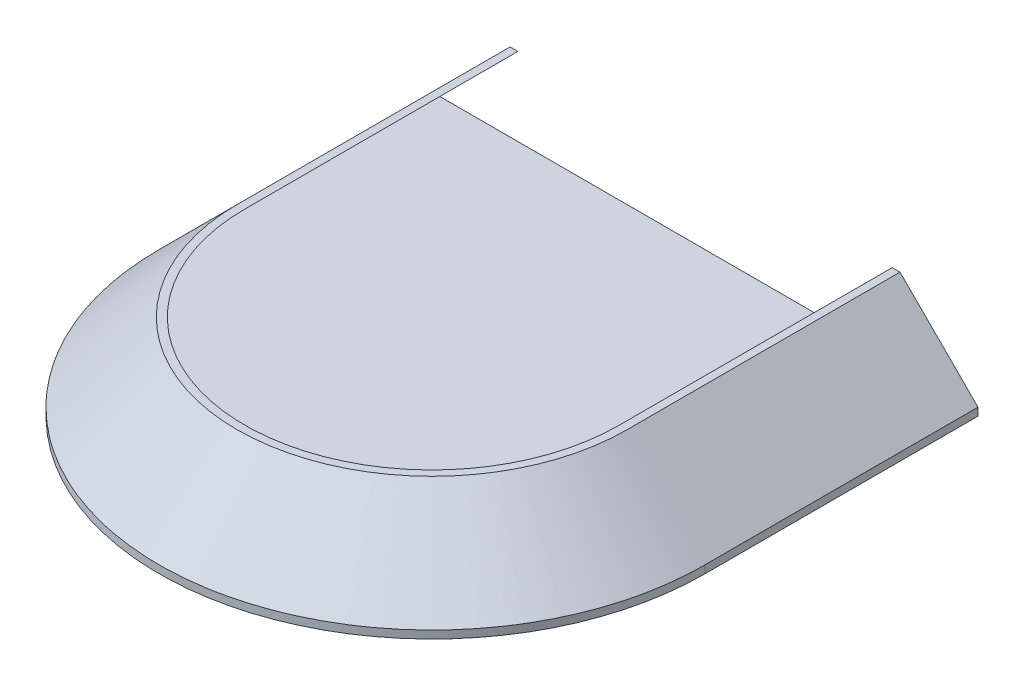
ISO-10303-21;
HEADER;
FILE_DESCRIPTION(('STEP AP214'),'2;1');
FILE_NAME('part.step','',(''),(''),'','','');
FILE_SCHEMA(('AUTOMOTIVE_DESIGN { 1 0 10303 214 1 1 1 1 }'));
ENDSEC;
DATA;
#1=APPLICATION_CONTEXT('core data for automotive mechanical design processes');
#2=APPLICATION_PROTOCOL_DEFINITION('international standard','automotive_design',2000,#1);
#3=PRODUCT_CONTEXT('',#1,'mechanical');
#4=PRODUCT('Part','Part','',(#3));
#5=PRODUCT_RELATED_PRODUCT_CATEGORY('part','',(#4));
#6=PRODUCT_DEFINITION_FORMATION('','',#4);
#7=PRODUCT_DEFINITION_CONTEXT('part definition',#1,'design');
#8=PRODUCT_DEFINITION('design','',#6,#7);
#9=PRODUCT_DEFINITION_SHAPE('','',#8);
#10=(LENGTH_UNIT() NAMED_UNIT(*) SI_UNIT(.MILLI.,.METRE.));
#11=(NAMED_UNIT(*) PLANE_ANGLE_UNIT() SI_UNIT($,.RADIAN.));
#12=(NAMED_UNIT(*) SI_UNIT($,.STERADIAN.) SOLID_ANGLE_UNIT());
#13=UNCERTAINTY_MEASURE_WITH_UNIT(LENGTH_MEASURE(1.E-05),#10,'distance_accuracy_value','');
#14=(GEOMETRIC_REPRESENTATION_CONTEXT(3) GLOBAL_UNCERTAINTY_ASSIGNED_CONTEXT((#13)) GLOBAL_UNIT_ASSIGNED_CONTEXT((#10,
#11,#12)) REPRESENTATION_CONTEXT('',''));
#15=CARTESIAN_POINT('',(0.,0.,0.));
#16=DIRECTION('',(0.,0.,1.));
#17=DIRECTION('',(1.,0.,0.));
#18=AXIS2_PLACEMENT_3D('',#15,#16,#17);
#19=CARTESIAN_POINT('',(460.336189438101,915.638937529955,1540.02120328592));
#20=DIRECTION('',(0.,1.,0.));
#21=DIRECTION('',(0.,0.,1.));
#22=AXIS2_PLACEMENT_3D('',#19,#20,#21);
#23=PLANE('',#22);
#24=DIRECTION('',(-1.,0.,0.));
#25=VECTOR('',#24,1.);
#26=CARTESIAN_POINT('',(549.236189438101,915.638937529955,1451.12120328592));
#27=LINE('',#26,#25);
#28=CARTESIAN_POINT('',(546.696189438101,915.638937529955,1451.12120328592));
#29=VERTEX_POINT('',#28);
#30=CARTESIAN_POINT('',(373.976189438101,915.638937529955,1451.12120328592));
#31=VERTEX_POINT('',#30);
#32=EDGE_CURVE('E426',#29,#31,#27,.T.);
#33=ORIENTED_EDGE('',*,*,#32,.T.);
#34=DIRECTION('',(0.,0.,-1.));
#35=VECTOR('',#34,1.);
#36=CARTESIAN_POINT('',(373.976189438101,915.638937529955,1451.12120328592));
#37=LINE('',#36,#35);
#38=CARTESIAN_POINT('',(373.976189438101,915.638937529955,1540.02120328592));
#39=VERTEX_POINT('',#38);
#40=EDGE_CURVE('E451',#39,#31,#37,.T.);
#41=ORIENTED_EDGE('',*,*,#40,.F.);
#42=CARTESIAN_POINT('',(546.696189438101,915.638937529955,1540.02120328592));
#43=CARTESIAN_POINT('',(546.69618439153,915.638937529955,1541.23535219559));
#44=CARTESIAN_POINT('',(546.670505692244,915.638937529955,1542.44949529698));
#45=CARTESIAN_POINT('',(546.568005410644,915.638937529955,1544.87557297002));
#46=CARTESIAN_POINT('',(546.491185871674,915.638937529955,1546.08750762799));
#47=CARTESIAN_POINT('',(546.286610799454,915.638937529955,1548.50703930376));
#48=CARTESIAN_POINT('',(546.158856510747,915.638937529955,1549.71463642683));
#49=CARTESIAN_POINT('',(545.852610112405,915.638937529955,1552.12336926867));
#50=CARTESIAN_POINT('',(545.67411853701,915.638937529955,1553.32450505534));
#51=CARTESIAN_POINT('',(545.266675008717,915.638937529955,1555.71733474795));
#52=CARTESIAN_POINT('',(545.037757996229,915.638937529955,1556.90903460272));
#53=CARTESIAN_POINT('',(544.529827402411,915.638937529955,1559.28169752831));
#54=CARTESIAN_POINT('',(544.250814302356,915.638937529955,1560.46266070217));
#55=CARTESIAN_POINT('',(543.643364107768,915.638937529955,1562.81179284593));
#56=CARTESIAN_POINT('',(543.314927230122,915.638937529954,1563.97996187195));
#57=CARTESIAN_POINT('',(542.609206332688,915.638937529955,1566.30146843609));
#58=CARTESIAN_POINT('',(542.23192264606,915.638937529957,1567.4548060753));
#59=CARTESIAN_POINT('',(541.562683324696,915.638937529956,1569.36360383138));
#60=CARTESIAN_POINT('',(541.284099063734,915.638937529955,1570.12377845583));
#61=CARTESIAN_POINT('',(540.705612424955,915.638937529955,1571.63597666617));
#62=CARTESIAN_POINT('',(540.405709619327,915.638937529955,1572.38800008814));
#63=CARTESIAN_POINT('',(539.474388514593,915.638937529955,1574.63092043347));
#64=CARTESIAN_POINT('',(538.811304982171,915.638937529955,1576.10881730184));
#65=CARTESIAN_POINT('',(537.403317268604,915.638937529955,1579.02496361593));
#66=CARTESIAN_POINT('',(536.658413131512,915.638937529955,1580.463213083));
#67=CARTESIAN_POINT('',(535.08914554377,915.638937529955,1583.29547307954));
#68=CARTESIAN_POINT('',(534.264797427979,915.638937529955,1584.68949207792));
#69=CARTESIAN_POINT('',(532.970446372624,915.638937529955,1586.74386662349));
#70=CARTESIAN_POINT('',(532.529334789541,915.638937529955,1587.42258157969));
#71=CARTESIAN_POINT('',(531.628167606513,915.638937529955,1588.76730031018));
#72=CARTESIAN_POINT('',(531.168112206796,915.638937529955,1589.43330421871));
#73=CARTESIAN_POINT('',(529.760140445629,915.638937529955,1591.41152750533));
#74=CARTESIAN_POINT('',(528.784335608015,915.638937529954,1592.7040899955));
#75=CARTESIAN_POINT('',(527.015003356373,915.638937529954,1594.91590148438));
#76=CARTESIAN_POINT('',(526.236968622904,915.638937529955,1595.84762737363));
#77=CARTESIAN_POINT('',(524.642285525517,915.638937529955,1597.67758562142));
#78=CARTESIAN_POINT('',(523.825634938852,915.638937529955,1598.5758160466));
#79=CARTESIAN_POINT('',(522.155105476662,915.638937529955,1600.33691326455));
#80=CARTESIAN_POINT('',(521.30122738258,915.638937529955,1601.19978079889));
#81=CARTESIAN_POINT('',(519.557832796711,915.638937529955,1602.88870871453));
#82=CARTESIAN_POINT('',(518.668316711846,915.638937529955,1603.71476951589));
#83=CARTESIAN_POINT('',(516.855185954716,915.638937529955,1605.32886320682));
#84=CARTESIAN_POINT('',(515.931566104838,915.638937529955,1606.1168902799));
#85=CARTESIAN_POINT('',(514.051989560718,915.638937529955,1607.65339019125));
#86=CARTESIAN_POINT('',(513.096032835804,915.638937529955,1608.401862992));
#87=CARTESIAN_POINT('',(511.153415686436,915.638937529955,1609.85785014707));
#88=CARTESIAN_POINT('',(510.166755231706,915.638937529955,1610.565364461));
#89=CARTESIAN_POINT('',(508.16437843336,915.638937529954,1611.93800616568));
#90=CARTESIAN_POINT('',(507.148662085295,915.638937529953,1612.60313354994));
#91=CARTESIAN_POINT('',(505.09024822099,915.638937529953,1613.8899028947));
#92=CARTESIAN_POINT('',(504.047554524414,915.638937529954,1614.51155096568));
#93=CARTESIAN_POINT('',(501.936952538603,915.638937529955,1615.7104373739));
#94=CARTESIAN_POINT('',(500.869044279825,915.638937529955,1616.28767576478));
#95=CARTESIAN_POINT('',(498.709863837533,915.638937529955,1617.39672397846));
#96=CARTESIAN_POINT('',(497.618591756358,915.638937529955,1617.92853400019));
#97=CARTESIAN_POINT('',(495.414667836763,915.638937529955,1618.9455919365));
#98=CARTESIAN_POINT('',(494.302015746628,915.638937529955,1619.43083930247));
#99=CARTESIAN_POINT('',(490.934826814243,915.638937529955,1620.81530136655));
#100=CARTESIAN_POINT('',(488.650423069511,915.638937529955,1621.64356185504));
#101=CARTESIAN_POINT('',(485.178852429648,915.638937529955,1622.73956062363));
#102=CARTESIAN_POINT('',(484.014110037235,915.638937529955,1623.08050796758));
#103=CARTESIAN_POINT('',(481.670905722688,915.638937529955,1623.7132089889));
#104=CARTESIAN_POINT('',(480.492440455143,915.638937529954,1624.00495039041));
#105=CARTESIAN_POINT('',(478.12360990974,915.638937529954,1624.53850850277));
#106=CARTESIAN_POINT('',(476.933238441319,915.638937529955,1624.7802976571));
#107=CARTESIAN_POINT('',(474.54319877114,915.638937529955,1625.2133634915));
#108=CARTESIAN_POINT('',(473.343529544223,915.638937529955,1625.40463451754));
#109=CARTESIAN_POINT('',(470.937261630072,915.638937529955,1625.73648404064));
#110=CARTESIAN_POINT('',(469.730663270572,915.638937529955,1625.8770649155));
#111=CARTESIAN_POINT('',(467.312619208529,915.638937529955,1626.10732186026));
#112=CARTESIAN_POINT('',(466.101173507352,915.638937529955,1626.19699794451));
#113=CARTESIAN_POINT('',(463.675384697821,915.638937529955,1626.32524053165));
#114=CARTESIAN_POINT('',(462.46104116376,915.638937529955,1626.36379899441));
#115=CARTESIAN_POINT('',(460.032134596746,915.638937529955,1626.38946949797));
#116=CARTESIAN_POINT('',(458.817571705814,915.638937529955,1626.37659508426));
#117=CARTESIAN_POINT('',(456.389943212374,915.638937529955,1626.29957212948));
#118=CARTESIAN_POINT('',(455.176877757879,915.638937529955,1626.23541887184));
#119=CARTESIAN_POINT('',(452.754509860456,915.638937529955,1626.05611104466));
#120=CARTESIAN_POINT('',(451.545207706074,915.638937529956,1625.94095265687));
#121=CARTESIAN_POINT('',(447.927687510655,915.638937529956,1625.51944763408));
#122=CARTESIAN_POINT('',(445.527897677054,915.638937529955,1625.13700852104));
#123=CARTESIAN_POINT('',(440.769244230465,915.638937529954,1624.1706057181));
#124=CARTESIAN_POINT('',(438.410380603506,915.638937529955,1623.58664209698));
#125=CARTESIAN_POINT('',(434.915668346034,915.638937529955,1622.56380581404));
#126=CARTESIAN_POINT('',(433.757885995372,915.638937529955,1622.19832365661));
#127=CARTESIAN_POINT('',(431.458733077256,915.638937529955,1621.41898000073));
#128=CARTESIAN_POINT('',(430.317361292551,915.638937529955,1621.00512211155));
#129=CARTESIAN_POINT('',(428.053217095243,915.638937529955,1620.1296636988));
#130=CARTESIAN_POINT('',(426.930442975184,915.638937529955,1619.6680675866));
#131=CARTESIAN_POINT('',(424.705129490575,915.638937529955,1618.69766475017));
#132=CARTESIAN_POINT('',(423.60259551661,915.638937529954,1618.18884566138));
#133=CARTESIAN_POINT('',(421.420323523713,915.638937529954,1617.12540762211));
#134=CARTESIAN_POINT('',(420.340577661842,915.638937529955,1616.5708047627));
#135=CARTESIAN_POINT('',(418.205365980915,915.638937529955,1615.41667919999));
#136=CARTESIAN_POINT('',(417.149900169885,915.638937529955,1614.81715648184));
#137=CARTESIAN_POINT('',(415.065073793007,915.638937529955,1613.57420372075));
#138=CARTESIAN_POINT('',(414.035714472373,915.638937529955,1612.93077158881));
#139=CARTESIAN_POINT('',(412.005213051576,915.638937529955,1611.60107660441));
#140=CARTESIAN_POINT('',(411.004067814953,915.638937529955,1610.91481854025));
#141=CARTESIAN_POINT('',(409.031509068459,915.638937529955,1609.5005028472));
#142=CARTESIAN_POINT('',(408.060099608411,915.638937529955,1608.77243956321));
#143=CARTESIAN_POINT('',(406.149107685289,915.638937529955,1607.27634332291));
#144=CARTESIAN_POINT('',(405.20951735611,915.638937529955,1606.50832036601));
#145=CARTESIAN_POINT('',(402.440133068216,915.638937529955,1604.14571883847));
#146=CARTESIAN_POINT('',(400.659531037887,915.638937529954,1602.4924678861));
#147=CARTESIAN_POINT('',(398.098300128227,915.638937529954,1599.9045132629));
#148=CARTESIAN_POINT('',(397.262528367343,915.638937529955,1599.02348124504));
#149=CARTESIAN_POINT('',(395.628844627168,915.638937529955,1597.22685692103));
#150=CARTESIAN_POINT('',(394.830932248873,915.638937529955,1596.31126497931));
#151=CARTESIAN_POINT('',(393.274363105333,915.638937529955,1594.44731828658));
#152=CARTESIAN_POINT('',(392.515706884851,915.638937529955,1593.49896308123));
#153=CARTESIAN_POINT('',(391.038972872367,915.638937529955,1591.57116294201));
#154=CARTESIAN_POINT('',(390.320894946864,915.638937529955,1590.59171811043));
#155=CARTESIAN_POINT('',(388.926457851268,915.638937529955,1588.60308613078));
#156=CARTESIAN_POINT('',(388.250112465202,915.638937529955,1587.59388931672));
#157=CARTESIAN_POINT('',(386.940737674612,915.638937529955,1585.54775580064));
#158=CARTESIAN_POINT('',(386.307708965098,915.638937529955,1584.51081865391));
#159=CARTESIAN_POINT('',(385.085933942269,915.638937529955,1582.41118554293));
#160=CARTESIAN_POINT('',(384.497187174675,915.638937529955,1581.34848984307));
#161=CARTESIAN_POINT('',(383.365001672144,915.638937529955,1579.19934464422));
#162=CARTESIAN_POINT('',(382.821560210145,915.638937529954,1578.11289657994));
#163=CARTESIAN_POINT('',(381.607255445154,915.638937529954,1575.55182305822));
#164=CARTESIAN_POINT('',(380.954373493224,915.638937529955,1574.0686259626));
#165=CARTESIAN_POINT('',(379.733325971631,915.638937529955,1571.06774551318));
#166=CARTESIAN_POINT('',(379.165163301054,915.638937529955,1569.55006098126));
#167=CARTESIAN_POINT('',(378.11498553415,915.638937529955,1566.48497175702));
#168=CARTESIAN_POINT('',(377.632981694861,915.638937529955,1564.93756321032));
#169=CARTESIAN_POINT('',(376.757177579997,915.638937529955,1561.82017718868));
#170=CARTESIAN_POINT('',(376.363257447008,915.638937529955,1560.25023351381));
#171=CARTESIAN_POINT('',(375.839072661072,915.638937529955,1557.88086021843));
#172=CARTESIAN_POINT('',(375.675463323867,915.638937529955,1557.08867803807));
#173=CARTESIAN_POINT('',(375.37064019164,915.638937529955,1555.50001730312));
#174=CARTESIAN_POINT('',(375.229426652541,915.638937529955,1554.70353869954));
#175=CARTESIAN_POINT('',(374.839612869735,915.638937529955,1552.30942259147));
#176=CARTESIAN_POINT('',(374.624622499545,915.638937529955,1550.70612360546));
#177=CARTESIAN_POINT('',(374.37504209994,915.638937529955,1548.34395761629));
#178=CARTESIAN_POINT('',(374.305269103911,915.638937529955,1547.58859862234));
#179=CARTESIAN_POINT('',(374.185623936858,915.638937529955,1546.07643454344));
#180=CARTESIAN_POINT('',(374.135747586496,915.638937529955,1545.31962979578));
#181=CARTESIAN_POINT('',(374.055994575314,915.638937529955,1543.80622833316));
#182=CARTESIAN_POINT('',(374.026085016392,915.638937529955,1543.04963333932));
#183=CARTESIAN_POINT('',(373.986180929994,915.638937529955,1541.53576177385));
#184=CARTESIAN_POINT('',(373.976190526646,915.638937529955,1540.77848509353));
#185=CARTESIAN_POINT('',(373.976189438101,915.638937529955,1540.02120328592));
#186=B_SPLINE_CURVE_WITH_KNOTS('',3,(#42,#43,#44,#45,#46,#47,#48,#49,#50,#51,#52,#53,#54,#55,
#56,#57,#58,#59,#60,#61,#62,#63,#64,#65,#66,#67,#68,#69,#70,#71,#72,#73,#74,#75,#76,#77,#78,#79,
#80,#81,#82,#83,#84,#85,#86,#87,#88,#89,#90,#91,#92,#93,#94,#95,#96,#97,#98,#99,#100,#101,#102,
#103,#104,#105,#106,#107,#108,#109,#110,#111,#112,#113,#114,#115,#116,#117,#118,#119,#120,#121,
#122,#123,#124,#125,#126,#127,#128,#129,#130,#131,#132,#133,#134,#135,#136,#137,#138,#139,#140,
#141,#142,#143,#144,#145,#146,#147,#148,#149,#150,#151,#152,#153,#154,#155,#156,#157,#158,#159,
#160,#161,#162,#163,#164,#165,#166,#167,#168,#169,#170,#171,#172,#173,#174,#175,#176,#177,#178,
#179,#180,#181,#182,#183,#184,#185),.UNSPECIFIED.,.F.,.F.,(4,2,2,2,2,2,2,2,2,2,2,2,2,2,2,2,2,2,
2,2,2,2,2,2,2,2,2,2,2,2,2,2,2,2,2,2,2,2,2,2,2,2,2,2,2,2,2,2,2,2,2,2,2,2,2,2,2,2,2,2,2,2,2,2,2,2,
2,2,2,2,2,4),(0.,3.64216773375541,7.28418995256373,10.9261231874601,14.5680180758554,
18.2073973440038,21.846741650359,25.4860699866195,29.1253735021626,31.5539081187136,
33.9824914836629,38.8391824636751,43.6958708288144,48.5516235909066,50.9797384844486,
53.4078277206427,58.2635403419202,61.9041463035657,65.5449620757926,69.185701460444,
72.8263992862276,76.4676521316964,80.1089084308974,83.7501683208051,87.3914287685269,
91.0321764494908,94.6729197329121,98.3136470723864,101.954417301791,109.233825148058,
112.873884799135,116.514851230002,120.157820893437,123.801198107912,127.444404395184,
131.087609656005,134.73138787841,138.374206530562,142.017360284074,145.660786809869,
152.941781446898,160.222773598442,163.864180981166,167.505316855185,171.146116561825,
174.787872257383,178.428353435218,182.068835816409,185.709491514166,189.349740883757,
192.990483845969,196.630320099189,203.909275634303,207.551616847764,211.193919665501,
214.836273014355,218.478614379345,222.122152419781,225.765748906492,229.409308009196,
233.052647636588,237.911564027117,242.770646651185,247.630363672885,252.483427177749,
254.909846333057,257.336293213571,262.186176401941,264.461712205973,266.736769776298,
269.008069555663,271.2798395436),.UNSPECIFIED.);
#187=CARTESIAN_POINT('',(546.696189438101,915.638937529955,1540.02120328592));
#188=VERTEX_POINT('',#187);
#189=EDGE_CURVE('E250',#188,#39,#186,.T.);
#190=ORIENTED_EDGE('',*,*,#189,.F.);
#191=DIRECTION('',(0.,0.,1.));
#192=VECTOR('',#191,1.);
#193=CARTESIAN_POINT('',(546.696189438101,915.638937529955,1540.02120328592));
#194=LINE('',#193,#192);
#195=EDGE_CURVE('E249',#29,#188,#194,.T.);
#196=ORIENTED_EDGE('',*,*,#195,.F.);
#197=EDGE_LOOP('',(#33,#41,#190,#196));
#198=FACE_BOUND('',#197,.T.);
#199=ADVANCED_FACE('F164',(#198),#23,.T.);
#200=CARTESIAN_POINT('',(549.236189438101,915.638937529955,1451.12120328592));
#201=DIRECTION('',(0.,0.,1.));
#202=DIRECTION('',(1.,0.,0.));
#203=AXIS2_PLACEMENT_3D('',#200,#201,#202);
#204=PLANE('',#203);
#205=DIRECTION('',(-1.,0.,0.));
#206=VECTOR('',#205,1.);
#207=CARTESIAN_POINT('',(549.236189438101,913.098937529955,1451.12120328592));
#208=LINE('',#207,#206);
#209=CARTESIAN_POINT('',(549.236189438101,913.098937529955,1451.12120328592));
#210=VERTEX_POINT('',#209);
#211=CARTESIAN_POINT('',(371.436189438101,913.098937529955,1451.12120328592));
#212=VERTEX_POINT('',#211);
#213=EDGE_CURVE('E421',#210,#212,#208,.T.);
#214=ORIENTED_EDGE('',*,*,#213,.T.);
#215=DIRECTION('',(0.,-1.,0.));
#216=VECTOR('',#215,1.);
#217=CARTESIAN_POINT('',(371.436189438101,915.638937529955,1451.12120328592));
#218=LINE('',#217,#216);
#219=CARTESIAN_POINT('',(371.436189438101,915.638937529955,1451.12120328592));
#220=VERTEX_POINT('',#219);
#221=EDGE_CURVE('E12',#220,#212,#218,.T.);
#222=ORIENTED_EDGE('',*,*,#221,.F.);
#223=DIRECTION('',(-0.707106781186546,-0.707106781186549,0.));
#224=VECTOR('',#223,1.);
#225=CARTESIAN_POINT('',(384.136189438101,928.338937529955,1451.12120328592));
#226=LINE('',#225,#224);
#227=CARTESIAN_POINT('',(396.836189438101,941.038937529955,1451.12120328592));
#228=VERTEX_POINT('',#227);
#229=EDGE_CURVE('E246',#228,#220,#226,.T.);
#230=ORIENTED_EDGE('',*,*,#229,.F.);
#231=DIRECTION('',(-1.,0.,0.));
#232=VECTOR('',#231,1.);
#233=CARTESIAN_POINT('',(396.836189438101,941.038937529955,1451.12120328592));
#234=LINE('',#233,#232);
#235=CARTESIAN_POINT('',(399.376189438101,941.038937529955,1451.12120328592));
#236=VERTEX_POINT('',#235);
#237=EDGE_CURVE('E348',#236,#228,#234,.T.);
#238=ORIENTED_EDGE('',*,*,#237,.F.);
#239=DIRECTION('',(0.707106781186547,0.707106781186548,0.));
#240=VECTOR('',#239,1.);
#241=CARTESIAN_POINT('',(386.676189438101,928.338937529955,1451.12120328592));
#242=LINE('',#241,#240);
#243=EDGE_CURVE('E303',#31,#236,#242,.T.);
#244=ORIENTED_EDGE('',*,*,#243,.F.);
#245=ORIENTED_EDGE('',*,*,#32,.F.);
#246=DIRECTION('',(0.707106781186547,-0.707106781186547,0.));
#247=VECTOR('',#246,1.);
#248=CARTESIAN_POINT('',(533.996189438101,928.338937529955,1451.12120328592));
#249=LINE('',#248,#247);
#250=CARTESIAN_POINT('',(521.296189438101,941.038937529955,1451.12120328592));
#251=VERTEX_POINT('',#250);
#252=EDGE_CURVE('E193',#251,#29,#249,.T.);
#253=ORIENTED_EDGE('',*,*,#252,.F.);
#254=DIRECTION('',(-1.,0.,0.));
#255=VECTOR('',#254,1.);
#256=CARTESIAN_POINT('',(523.836189438101,941.038937529955,1451.12120328592));
#257=LINE('',#256,#255);
#258=CARTESIAN_POINT('',(523.836189438101,941.038937529955,1451.12120328592));
#259=VERTEX_POINT('',#258);
#260=EDGE_CURVE('E390',#259,#251,#257,.T.);
#261=ORIENTED_EDGE('',*,*,#260,.F.);
#262=DIRECTION('',(0.707106781186547,-0.707106781186547,0.));
#263=VECTOR('',#262,1.);
#264=CARTESIAN_POINT('',(536.536189438101,928.338937529955,1451.12120328592));
#265=LINE('',#264,#263);
#266=CARTESIAN_POINT('',(549.236189438101,915.638937529955,1451.12120328592));
#267=VERTEX_POINT('',#266);
#268=EDGE_CURVE('E297',#259,#267,#265,.T.);
#269=ORIENTED_EDGE('',*,*,#268,.T.);
#270=DIRECTION('',(0.,-1.,0.));
#271=VECTOR('',#270,1.);
#272=CARTESIAN_POINT('',(549.236189438101,915.638937529955,1451.12120328592));
#273=LINE('',#272,#271);
#274=EDGE_CURVE('E236',#267,#210,#273,.T.);
#275=ORIENTED_EDGE('',*,*,#274,.T.);
#276=EDGE_LOOP('',(#214,#222,#230,#238,#244,#245,#253,#261,#269,#275));
#277=FACE_BOUND('',#276,.T.);
#278=ADVANCED_FACE('F170',(#277),#204,.F.);
#279=CARTESIAN_POINT('',(371.436189438101,915.638937529955,1451.12120328592));
#280=DIRECTION('',(1.,0.,0.));
#281=DIRECTION('',(0.,0.,-1.));
#282=AXIS2_PLACEMENT_3D('',#279,#280,#281);
#283=PLANE('',#282);
#284=DIRECTION('',(0.,0.,1.));
#285=VECTOR('',#284,1.);
#286=CARTESIAN_POINT('',(371.436189438101,913.098937529955,1451.12120328592));
#287=LINE('',#286,#285);
#288=CARTESIAN_POINT('',(371.436189438101,913.098937529955,1540.02120328592));
#289=VERTEX_POINT('',#288);
#290=EDGE_CURVE('E464',#212,#289,#287,.T.);
#291=ORIENTED_EDGE('',*,*,#290,.T.);
#292=DIRECTION('',(0.,-1.,0.));
#293=VECTOR('',#292,1.);
#294=CARTESIAN_POINT('',(371.436189438101,915.638937529955,1540.02120328592));
#295=LINE('',#294,#293);
#296=CARTESIAN_POINT('',(371.436189438101,915.638937529955,1540.02120328592));
#297=VERTEX_POINT('',#296);
#298=EDGE_CURVE('E185',#297,#289,#295,.T.);
#299=ORIENTED_EDGE('',*,*,#298,.F.);
#300=DIRECTION('',(0.,0.,-1.));
#301=VECTOR('',#300,1.);
#302=CARTESIAN_POINT('',(371.436189438101,915.638937529955,1451.12120328592));
#303=LINE('',#302,#301);
#304=EDGE_CURVE('E214',#220,#297,#303,.F.);
#305=ORIENTED_EDGE('',*,*,#304,.F.);
#306=ORIENTED_EDGE('',*,*,#221,.T.);
#307=EDGE_LOOP('',(#291,#299,#305,#306));
#308=FACE_BOUND('',#307,.T.);
#309=ADVANCED_FACE('F488',(#308),#283,.F.);
#310=CARTESIAN_POINT('',(460.336189438101,915.638937529955,1540.02120328592));
#311=DIRECTION('',(0.,-1.,0.));
#312=DIRECTION('',(0.,0.,-1.));
#313=AXIS2_PLACEMENT_3D('',#310,#311,#312);
#314=CYLINDRICAL_SURFACE('',#313,88.9);
#315=CARTESIAN_POINT('',(460.336189438101,913.098937529955,1540.02120328592));
#316=DIRECTION('',(0.,1.,0.));
#317=DIRECTION('',(0.,0.,1.));
#318=AXIS2_PLACEMENT_3D('',#315,#316,#317);
#319=CIRCLE('',#318,88.9);
#320=CARTESIAN_POINT('',(549.236189438101,913.098937529955,1540.02120328592));
#321=VERTEX_POINT('',#320);
#322=EDGE_CURVE('E231',#289,#321,#319,.T.);
#323=ORIENTED_EDGE('',*,*,#322,.T.);
#324=DIRECTION('',(0.,-1.,0.));
#325=VECTOR('',#324,1.);
#326=CARTESIAN_POINT('',(549.236189438101,915.638937529955,1540.02120328592));
#327=LINE('',#326,#325);
#328=CARTESIAN_POINT('',(549.236189438101,915.638937529955,1540.02120328592));
#329=VERTEX_POINT('',#328);
#330=EDGE_CURVE('E234',#329,#321,#327,.T.);
#331=ORIENTED_EDGE('',*,*,#330,.F.);
#332=CARTESIAN_POINT('',(371.436189438101,915.638937529955,1540.02120328592));
#333=CARTESIAN_POINT('',(371.436172601236,915.638915719159,1541.27138922583));
#334=CARTESIAN_POINT('',(371.462560546011,915.638855516975,1542.52157391952));
#335=CARTESIAN_POINT('',(371.568022921688,915.638746690564,1545.01966750428));
#336=CARTESIAN_POINT('',(371.647095175147,915.638698065859,1546.26757648726));
#337=CARTESIAN_POINT('',(371.857800593028,915.638700738701,1548.7589192847));
#338=CARTESIAN_POINT('',(371.989432501829,915.638752033862,1550.00235320535));
#339=CARTESIAN_POINT('',(372.305016591574,915.638919297961,1552.48255513305));
#340=CARTESIAN_POINT('',(372.488968421898,915.639035266466,1553.71932318472));
#341=CARTESIAN_POINT('',(372.908721012205,915.639145315495,1556.18314436694));
#342=CARTESIAN_POINT('',(373.144485622698,915.639139480735,1557.41020365591));
#343=CARTESIAN_POINT('',(373.667514912584,915.639027064634,1559.85328354445));
#344=CARTESIAN_POINT('',(373.954779139274,915.63892048418,1561.06930424094));
#345=CARTESIAN_POINT('',(374.58030058942,915.638790299321,1563.48815868492));
#346=CARTESIAN_POINT('',(374.918557503671,915.638766694415,1564.69099251232));
#347=CARTESIAN_POINT('',(375.645449296185,915.638820037939,1567.0813062838));
#348=CARTESIAN_POINT('',(376.03408400335,915.638896986028,1568.26878628002));
#349=CARTESIAN_POINT('',(376.99915329374,915.639062382313,1571.01998680783));
#350=CARTESIAN_POINT('',(377.594967438694,915.639146092493,1572.57695307153));
#351=CARTESIAN_POINT('',(378.873156692747,915.639054740712,1575.65491547006));
#352=CARTESIAN_POINT('',(379.55553294406,915.638879675336,1577.17591112994));
#353=CARTESIAN_POINT('',(381.004683446968,915.638719110153,1580.17713781617));
#354=CARTESIAN_POINT('',(381.77145771773,915.63873361039,1581.65736883327));
#355=CARTESIAN_POINT('',(383.386882169891,915.638916473653,1584.57218108208));
#356=CARTESIAN_POINT('',(384.235516066335,915.639084806133,1586.00677131826));
#357=CARTESIAN_POINT('',(385.567811998309,915.63915942573,1588.12103662957));
#358=CARTESIAN_POINT('',(386.021824142243,915.639154648019,1588.81955355787));
#359=CARTESIAN_POINT('',(386.949298634718,915.639082208964,1590.20355288372));
#360=CARTESIAN_POINT('',(387.422761093244,915.639014547264,1590.88903520753));
#361=CARTESIAN_POINT('',(388.871772373644,915.638832766464,1592.92509567119));
#362=CARTESIAN_POINT('',(389.876038849803,915.638739832936,1594.25543606763));
#363=CARTESIAN_POINT('',(391.697395644628,915.638751426673,1596.53215859046));
#364=CARTESIAN_POINT('',(392.498525384607,915.638812402856,1597.491394756));
#365=CARTESIAN_POINT('',(394.140587141623,915.638990703394,1599.37533938305));
#366=CARTESIAN_POINT('',(394.981521635558,915.63910803126,1600.30004568946));
#367=CARTESIAN_POINT('',(396.701600023465,915.639176381851,1602.11315610149));
#368=CARTESIAN_POINT('',(397.580743108391,915.639127408095,1603.00156097499));
#369=CARTESIAN_POINT('',(399.375686367442,915.638965988919,1604.74050833708));
#370=CARTESIAN_POINT('',(400.291485938056,915.638853544543,1605.59105144853));
#371=CARTESIAN_POINT('',(402.158272739833,915.638729269537,1607.25290659575));
#372=CARTESIAN_POINT('',(403.109265508542,915.638717454808,1608.06421241091));
#373=CARTESIAN_POINT('',(405.04461585341,915.638797282574,1609.64601072361));
#374=CARTESIAN_POINT('',(406.028973575075,915.63888892552,1610.41650304314));
#375=CARTESIAN_POINT('',(408.029297084994,915.639078557916,1611.91529852805));
#376=CARTESIAN_POINT('',(409.045262808346,915.639176547354,1612.64360178006));
#377=CARTESIAN_POINT('',(411.106996303432,915.63917046066,1614.05672487299));
#378=CARTESIAN_POINT('',(412.152764041045,915.63906638476,1614.74154476369));
#379=CARTESIAN_POINT('',(414.27219660581,915.638871557859,1616.06645522093));
#380=CARTESIAN_POINT('',(415.345860213733,915.638780806278,1616.70654773786));
#381=CARTESIAN_POINT('',(417.51921941117,915.638708355955,1617.94089820267));
#382=CARTESIAN_POINT('',(418.618915008167,915.638726657245,1618.53515613739));
#383=CARTESIAN_POINT('',(420.84238227842,915.638861371259,1619.67678045539));
#384=CARTESIAN_POINT('',(421.966153950591,915.638977783978,1620.22414684078));
#385=CARTESIAN_POINT('',(424.235774991109,915.639146107643,1621.27101469843));
#386=CARTESIAN_POINT('',(425.381624357552,915.639198018593,1621.77051617481));
#387=CARTESIAN_POINT('',(427.693289168268,915.63912190658,1622.72073556844));
#388=CARTESIAN_POINT('',(428.859103328509,915.638993895145,1623.17145660944));
#389=CARTESIAN_POINT('',(431.208696412214,915.638799564239,1624.02335044714));
#390=CARTESIAN_POINT('',(432.392475335771,915.638733244768,1624.42452324359));
#391=CARTESIAN_POINT('',(434.775893053352,915.638712765976,1625.17660726128));
#392=CARTESIAN_POINT('',(435.975531846193,915.638758606646,1625.52751848627));
#393=CARTESIAN_POINT('',(438.388536394884,915.638933666987,1626.178455467));
#394=CARTESIAN_POINT('',(439.601902150784,915.639062886658,1626.47848122256));
#395=CARTESIAN_POINT('',(442.04022825767,915.639187126359,1627.02711944113));
#396=CARTESIAN_POINT('',(443.26518884599,915.639182143637,1627.27573084936));
#397=CARTESIAN_POINT('',(445.724501961117,915.639047418586,1627.72109057594));
#398=CARTESIAN_POINT('',(446.958854487968,915.638917676258,1627.91783889405));
#399=CARTESIAN_POINT('',(449.434756756094,915.638747037991,1628.25912261312));
#400=CARTESIAN_POINT('',(450.676306497737,915.638706142058,1628.40365801141));
#401=CARTESIAN_POINT('',(453.164395525517,915.638736982048,1628.64025887692));
#402=CARTESIAN_POINT('',(454.410934811672,915.638808717971,1628.73232434396));
#403=CARTESIAN_POINT('',(456.906815189771,915.639008288704,1628.86382315895));
#404=CARTESIAN_POINT('',(458.156156345553,915.639136124804,1628.90325529524));
#405=CARTESIAN_POINT('',(460.655390313679,915.63920457089,1628.92941339312));
#406=CARTESIAN_POINT('',(461.905283126025,915.639145180875,1628.91613935451));
#407=CARTESIAN_POINT('',(464.403397851918,915.63896776211,1628.83690870686));
#408=CARTESIAN_POINT('',(465.651619765465,915.638849733361,1628.77095209781));
#409=CARTESIAN_POINT('',(468.14417314845,915.638716037133,1628.58647358972));
#410=CARTESIAN_POINT('',(469.388504617908,915.638700369654,1628.46795169093));
#411=CARTESIAN_POINT('',(471.870980387652,915.6387793231,1628.17856316049));
#412=CARTESIAN_POINT('',(473.10912510109,915.638873936558,1628.00770007298));
#413=CARTESIAN_POINT('',(475.577253576051,915.639075610003,1627.6139074743));
#414=CARTESIAN_POINT('',(476.80723637776,915.639182671427,1627.39097194739));
#415=CARTESIAN_POINT('',(479.256709090378,915.6391881389,1626.89344165539));
#416=CARTESIAN_POINT('',(480.476199001336,915.63908654495,1626.61884689055));
#417=CARTESIAN_POINT('',(482.902377010657,915.638887895818,1626.01852115532));
#418=CARTESIAN_POINT('',(484.109066572253,915.638790840113,1625.69279609848));
#419=CARTESIAN_POINT('',(486.507707194961,915.638704567528,1624.99074683554));
#420=CARTESIAN_POINT('',(487.699657447155,915.638715356542,1624.61441986568));
#421=CARTESIAN_POINT('',(490.06663280853,915.6388410116,1623.81184960102));
#422=CARTESIAN_POINT('',(491.241657917711,915.638955877643,1623.38560630622));
#423=CARTESIAN_POINT('',(493.572693601978,915.639134013792,1622.48396132618));
#424=CARTESIAN_POINT('',(494.728704178072,915.6391972839,1622.00855964354));
#425=CARTESIAN_POINT('',(497.019655305231,915.63913724417,1621.00944320192));
#426=CARTESIAN_POINT('',(498.154595856212,915.639013934331,1620.48572844274));
#427=CARTESIAN_POINT('',(500.401418187444,915.638818890594,1619.39090279048));
#428=CARTESIAN_POINT('',(501.513299365131,915.638747158042,1618.8197906608));
#429=CARTESIAN_POINT('',(503.711995251563,915.638713362147,1617.63119764421));
#430=CARTESIAN_POINT('',(504.798809960013,915.638751298805,1617.01371675676));
#431=CARTESIAN_POINT('',(506.945440708654,915.638915741798,1615.7334840038));
#432=CARTESIAN_POINT('',(508.00525673816,915.639042248169,1615.07073212037));
#433=CARTESIAN_POINT('',(510.09600507055,915.639171308435,1613.70113612778));
#434=CARTESIAN_POINT('',(511.126937374359,915.639173862335,1612.99429202003));
#435=CARTESIAN_POINT('',(513.158035646821,915.639053396356,1611.5378039229));
#436=CARTESIAN_POINT('',(514.158203108992,915.638930382583,1610.78816201626));
#437=CARTESIAN_POINT('',(516.126045810857,915.638765665689,1609.24737990705));
#438=CARTESIAN_POINT('',(517.093721048264,915.638723962575,1608.45623970156));
#439=CARTESIAN_POINT('',(518.994856949377,915.63874873474,1606.83386918112));
#440=CARTESIAN_POINT('',(519.928317673616,915.638815209827,1606.00263893711));
#441=CARTESIAN_POINT('',(521.759366338049,915.639001428004,1604.30156526923));
#442=CARTESIAN_POINT('',(522.656954289399,915.639121171076,1603.43172185738));
#443=CARTESIAN_POINT('',(524.414540612745,915.639179156411,1601.65509069846));
#444=CARTESIAN_POINT('',(525.274544147988,915.639117423684,1600.7483080593));
#445=CARTESIAN_POINT('',(526.95556531637,915.638952224096,1598.8992970722));
#446=CARTESIAN_POINT('',(527.776582907123,915.638848757189,1597.95706868574));
#447=CARTESIAN_POINT('',(529.378179094345,915.638737613934,1596.03883320963));
#448=CARTESIAN_POINT('',(530.15875732243,915.638729938459,1595.06282581241));
#449=CARTESIAN_POINT('',(531.678075874464,915.638817873051,1593.07877981447));
#450=CARTESIAN_POINT('',(532.416816376364,915.638913482679,1592.07074135001));
#451=CARTESIAN_POINT('',(533.851382549169,915.63908725485,1590.0240889281));
#452=CARTESIAN_POINT('',(534.547194240531,915.639165411731,1588.98546517167));
#453=CARTESIAN_POINT('',(535.894414940347,915.639137451594,1586.87978655698));
#454=CARTESIAN_POINT('',(536.545823214668,915.639031331532,1585.81273122905));
#455=CARTESIAN_POINT('',(537.803064582757,915.638852575464,1583.65210321068));
#456=CARTESIAN_POINT('',(538.408898023166,915.638779939205,1582.55853072201));
#457=CARTESIAN_POINT('',(539.573867887954,915.638733716224,1580.3469082039));
#458=CARTESIAN_POINT('',(540.133007218938,915.638760123333,1579.22885970352));
#459=CARTESIAN_POINT('',(541.382510714812,915.638924579501,1576.59282300686));
#460=CARTESIAN_POINT('',(542.054319192017,915.63909697476,1575.06599348095));
#461=CARTESIAN_POINT('',(543.311010443455,915.639146603944,1571.97695017997));
#462=CARTESIAN_POINT('',(543.895889897538,915.6390238266,1570.414735056));
#463=CARTESIAN_POINT('',(544.976935484884,915.638831900911,1567.2596920875));
#464=CARTESIAN_POINT('',(545.473090138768,915.638762759503,1565.6668603112));
#465=CARTESIAN_POINT('',(546.374418671055,915.638821008963,1562.45792243328));
#466=CARTESIAN_POINT('',(546.779716297725,915.638948130632,1560.84185121812));
#467=CARTESIAN_POINT('',(547.319046637613,915.639098874508,1558.40287936776));
#468=CARTESIAN_POINT('',(547.487384436467,915.639142465506,1557.58742944617));
#469=CARTESIAN_POINT('',(547.801090907211,915.639145037711,1555.95212408572));
#470=CARTESIAN_POINT('',(547.946459313789,915.639104017941,1555.1322685961));
#471=CARTESIAN_POINT('',(548.347779773044,915.638948540384,1552.66789225342));
#472=CARTESIAN_POINT('',(548.56917138366,915.638801653692,1551.01754692128));
#473=CARTESIAN_POINT('',(548.826076182458,915.63870721884,1548.58623505361));
#474=CARTESIAN_POINT('',(548.897871128894,915.638695241863,1547.80888754816));
#475=CARTESIAN_POINT('',(549.020953352387,915.638705041007,1546.25270303897));
#476=CARTESIAN_POINT('',(549.072244939445,915.63872681003,1545.47386638289));
#477=CARTESIAN_POINT('',(549.154230952711,915.638791601212,1543.91640809723));
#478=CARTESIAN_POINT('',(549.184959266649,915.6388345882,1543.13778823811));
#479=CARTESIAN_POINT('',(549.225941675997,915.638905972087,1541.5798481354));
#480=CARTESIAN_POINT('',(549.236191519796,915.638934365955,1540.80052777996));
#481=CARTESIAN_POINT('',(549.236189438102,915.638937529955,1540.02120328592));
#482=B_SPLINE_CURVE_WITH_KNOTS('',3,(#332,#333,#334,#335,#336,#337,#338,#339,#340,#341,#342,
#343,#344,#345,#346,#347,#348,#349,#350,#351,#352,#353,#354,#355,#356,#357,#358,#359,#360,#361,
#362,#363,#364,#365,#366,#367,#368,#369,#370,#371,#372,#373,#374,#375,#376,#377,#378,#379,#380,
#381,#382,#383,#384,#385,#386,#387,#388,#389,#390,#391,#392,#393,#394,#395,#396,#397,#398,#399,
#400,#401,#402,#403,#404,#405,#406,#407,#408,#409,#410,#411,#412,#413,#414,#415,#416,#417,#418,
#419,#420,#421,#422,#423,#424,#425,#426,#427,#428,#429,#430,#431,#432,#433,#434,#435,#436,#437,
#438,#439,#440,#441,#442,#443,#444,#445,#446,#447,#448,#449,#450,#451,#452,#453,#454,#455,#456,
#457,#458,#459,#460,#461,#462,#463,#464,#465,#466,#467,#468,#469,#470,#471,#472,#473,#474,#475,
#476,#477,#478,#479,#480,#481),.UNSPECIFIED.,.F.,.F.,(4,2,2,2,2,2,2,2,2,2,2,2,2,2,2,2,2,2,2,2,2,
2,2,2,2,2,2,2,2,2,2,2,2,2,2,2,2,2,2,2,2,2,2,2,2,2,2,2,2,2,2,2,2,2,2,2,2,2,2,2,2,2,2,2,2,2,2,2,2,
2,2,2,2,2,4),(0.,3.75027758274484,7.50040017612234,11.2504331866167,15.0004410670287,
18.7478408472371,22.4952076879251,26.242551806639,29.989883198599,34.9883566055943,
39.9868959759195,44.9854364814053,49.9829846321975,52.4819927843742,54.9810150693824,
59.9785328537379,63.7268622051769,67.4754251083915,71.2239086766023,74.9723305553452,
78.7213447660819,82.4703753285207,86.2193981933672,89.9684167659988,93.7172717570762,
97.4661278256103,101.214983724984,104.963839300892,108.712454668633,112.461070055805,
116.209685163331,119.958300284334,123.706992302156,127.455684337302,131.20437656409,
134.953068804596,138.70184734223,142.4506258953,146.199404449614,149.948182986506,
153.69670774199,157.44566576603,161.194623772691,164.943148507987,168.691878063693,
172.440607619467,176.189336976405,179.93806634804,183.68689355458,187.435720805565,
191.184549540414,194.933378155306,198.682024490451,202.430671089617,206.179311056205,
209.927949856946,213.676072050352,217.424198318819,221.17235872512,224.920503188065,
228.669861841565,232.41928246923,236.168674576033,239.917833117161,244.919356599563,
249.921071060061,254.923432184185,259.918938073289,262.416580538859,264.914251851743,
269.906481361312,272.248254452141,274.589535020859,276.926947656341,279.264845520329),.UNSPECIFIED.);
#483=EDGE_CURVE('E168',#297,#329,#482,.T.);
#484=ORIENTED_EDGE('',*,*,#483,.F.);
#485=ORIENTED_EDGE('',*,*,#298,.T.);
#486=EDGE_LOOP('',(#323,#331,#484,#485));
#487=FACE_BOUND('',#486,.T.);
#488=ADVANCED_FACE('F232',(#487),#314,.T.);
#489=CARTESIAN_POINT('',(549.236189438101,915.638937529955,1540.02120328592));
#490=DIRECTION('',(-1.,0.,0.));
#491=DIRECTION('',(0.,0.,1.));
#492=AXIS2_PLACEMENT_3D('',#489,#490,#491);
#493=PLANE('',#492);
#494=DIRECTION('',(0.,0.,-1.));
#495=VECTOR('',#494,1.);
#496=CARTESIAN_POINT('',(549.236189438101,913.098937529955,1540.02120328592));
#497=LINE('',#496,#495);
#498=EDGE_CURVE('E428',#321,#210,#497,.T.);
#499=ORIENTED_EDGE('',*,*,#498,.T.);
#500=ORIENTED_EDGE('',*,*,#274,.F.);
#501=DIRECTION('',(0.,0.,1.));
#502=VECTOR('',#501,1.);
#503=CARTESIAN_POINT('',(549.236189438101,915.638937529955,1540.02120328592));
#504=LINE('',#503,#502);
#505=EDGE_CURVE('E229',#329,#267,#504,.F.);
#506=ORIENTED_EDGE('',*,*,#505,.F.);
#507=ORIENTED_EDGE('',*,*,#330,.T.);
#508=EDGE_LOOP('',(#499,#500,#506,#507));
#509=FACE_BOUND('',#508,.T.);
#510=ADVANCED_FACE('F244',(#509),#493,.F.);
#511=CARTESIAN_POINT('',(460.336189438101,913.098937529955,1540.02120328592));
#512=DIRECTION('',(0.,1.,0.));
#513=DIRECTION('',(0.,0.,1.));
#514=AXIS2_PLACEMENT_3D('',#511,#512,#513);
#515=PLANE('',#514);
#516=ORIENTED_EDGE('',*,*,#213,.F.);
#517=ORIENTED_EDGE('',*,*,#498,.F.);
#518=ORIENTED_EDGE('',*,*,#322,.F.);
#519=ORIENTED_EDGE('',*,*,#290,.F.);
#520=EDGE_LOOP('',(#516,#517,#518,#519));
#521=FACE_BOUND('',#520,.T.);
#522=ADVANCED_FACE('F495',(#521),#515,.F.);
#523=CARTESIAN_POINT('',(460.336189438101,941.038937529955,1540.02120328592));
#524=DIRECTION('',(0.,1.,0.));
#525=DIRECTION('',(0.,0.,1.));
#526=AXIS2_PLACEMENT_3D('',#523,#524,#525);
#527=PLANE('',#526);
#528=DIRECTION('',(0.,0.,1.));
#529=VECTOR('',#528,1.);
#530=CARTESIAN_POINT('',(396.836189438101,941.038937529955,1451.12120328592));
#531=LINE('',#530,#529);
#532=CARTESIAN_POINT('',(396.836189438101,941.038937529955,1540.02120328551));
#533=VERTEX_POINT('',#532);
#534=EDGE_CURVE('E333',#228,#533,#531,.T.);
#535=ORIENTED_EDGE('',*,*,#534,.T.);
#536=CARTESIAN_POINT('',(460.336189438101,941.038937529955,1540.02120328592));
#537=DIRECTION('',(0.,1.,0.));
#538=DIRECTION('',(0.,0.,1.));
#539=AXIS2_PLACEMENT_3D('',#536,#537,#538);
#540=CIRCLE('',#539,63.5);
#541=CARTESIAN_POINT('',(523.836189438101,941.038937529955,1540.02120328557));
#542=VERTEX_POINT('',#541);
#543=EDGE_CURVE('E323',#533,#542,#540,.T.);
#544=ORIENTED_EDGE('',*,*,#543,.T.);
#545=DIRECTION('',(0.,0.,-1.));
#546=VECTOR('',#545,1.);
#547=CARTESIAN_POINT('',(523.836189438101,941.038937529955,1451.12120328592));
#548=LINE('',#547,#546);
#549=EDGE_CURVE('E313',#542,#259,#548,.T.);
#550=ORIENTED_EDGE('',*,*,#549,.T.);
#551=ORIENTED_EDGE('',*,*,#260,.T.);
#552=DIRECTION('',(0.,0.,1.));
#553=VECTOR('',#552,1.);
#554=CARTESIAN_POINT('',(521.296189438101,941.038937529955,1451.12120328592));
#555=LINE('',#554,#553);
#556=CARTESIAN_POINT('',(521.296189438101,941.038937529955,1540.02120328749));
#557=VERTEX_POINT('',#556);
#558=EDGE_CURVE('E378',#251,#557,#555,.T.);
#559=ORIENTED_EDGE('',*,*,#558,.T.);
#560=CARTESIAN_POINT('',(460.336189438101,941.038937529955,1540.02120328592));
#561=DIRECTION('',(0.,-1.,0.));
#562=DIRECTION('',(0.,0.,1.));
#563=AXIS2_PLACEMENT_3D('',#560,#561,#562);
#564=CIRCLE('',#563,60.96);
#565=CARTESIAN_POINT('',(399.376189438101,941.038937529955,1540.02120328545));
#566=VERTEX_POINT('',#565);
#567=EDGE_CURVE('E375',#557,#566,#564,.T.);
#568=ORIENTED_EDGE('',*,*,#567,.T.);
#569=DIRECTION('',(0.,0.,-1.));
#570=VECTOR('',#569,1.);
#571=CARTESIAN_POINT('',(399.376189438101,941.038937529955,1451.12120328592));
#572=LINE('',#571,#570);
#573=EDGE_CURVE('E353',#566,#236,#572,.T.);
#574=ORIENTED_EDGE('',*,*,#573,.T.);
#575=ORIENTED_EDGE('',*,*,#237,.T.);
#576=EDGE_LOOP('',(#535,#544,#550,#551,#559,#568,#574,#575));
#577=FACE_BOUND('',#576,.T.);
#578=ADVANCED_FACE('F268',(#577),#527,.T.);
#579=CARTESIAN_POINT('',(399.376189438101,941.038937529955,1451.12120328592));
#580=CARTESIAN_POINT('',(373.976189438101,915.638937529955,1451.12120328592));
#581=CARTESIAN_POINT('',(399.376189438101,941.038937529955,1458.52953661925));
#582=CARTESIAN_POINT('',(373.976189438101,915.638937529955,1458.52953661925));
#583=CARTESIAN_POINT('',(399.376189438102,941.038937529955,1473.83818209558));
#584=CARTESIAN_POINT('',(373.976189438102,915.638937529956,1472.91120363339));
#585=CARTESIAN_POINT('',(399.376189438101,941.038937529954,1497.19759353004));
#586=CARTESIAN_POINT('',(373.976189438101,915.638937529955,1494.17008819793));
#587=CARTESIAN_POINT('',(399.376189438102,941.038937529956,1519.65548856973));
#588=CARTESIAN_POINT('',(373.976189438102,915.638937529956,1515.98364195908));
#589=CARTESIAN_POINT('',(399.376189438101,941.038937529955,1533.45719573116));
#590=CARTESIAN_POINT('',(373.976189438101,915.638937529955,1531.58928180795));
#591=CARTESIAN_POINT('',(399.376189438101,941.038937529955,1544.2221073671));
#592=CARTESIAN_POINT('',(373.976189438101,915.638937529955,1545.41755498928));
#593=CARTESIAN_POINT('',(400.246261481592,941.038937529955,1552.5347156817));
#594=CARTESIAN_POINT('',(374.990897067214,915.638937529956,1556.29910249289));
#595=CARTESIAN_POINT('',(403.967606501913,941.038937529954,1564.27691107));
#596=CARTESIAN_POINT('',(379.644828001284,915.638937529953,1572.27413173007));
#597=CARTESIAN_POINT('',(409.854673472219,941.038937529954,1574.89387177905));
#598=CARTESIAN_POINT('',(387.379509864033,915.638937529956,1587.25454658377));
#599=CARTESIAN_POINT('',(417.612728805507,941.038937529956,1584.04609488986));
#600=CARTESIAN_POINT('',(397.996446155978,915.638937529954,1600.59682251087));
#601=CARTESIAN_POINT('',(426.909980331833,941.038937529955,1591.45496820416));
#602=CARTESIAN_POINT('',(411.146314826499,915.638937529957,1611.6983481146));
#603=CARTESIAN_POINT('',(437.386247979123,941.038937529956,1596.90288529614));
#604=CARTESIAN_POINT('',(426.339610135204,915.638937529953,1620.03791550357));
#605=CARTESIAN_POINT('',(448.660087805603,941.038937529953,1600.23408373559));
#606=CARTESIAN_POINT('',(442.967811287608,915.638937529955,1625.21219747145));
#607=CARTESIAN_POINT('',(460.336189438102,941.038937529955,1601.35489265829));
#608=CARTESIAN_POINT('',(460.336189438099,915.638937529956,1626.96607806085));
#609=CARTESIAN_POINT('',(472.012291070599,941.038937529956,1600.2340837356));
#610=CARTESIAN_POINT('',(477.704567588601,915.638937529954,1625.21219747146));
#611=CARTESIAN_POINT('',(483.286130897081,941.038937529954,1596.90288529614));
#612=CARTESIAN_POINT('',(494.332768740996,915.638937529956,1620.03791550356));
#613=CARTESIAN_POINT('',(493.762398544369,941.038937529955,1591.45496820416));
#614=CARTESIAN_POINT('',(509.526064049707,915.638937529953,1611.69834811461));
#615=CARTESIAN_POINT('',(503.059650070696,941.038937529955,1584.04609488985));
#616=CARTESIAN_POINT('',(522.675932720223,915.638937529956,1600.59682251086));
#617=CARTESIAN_POINT('',(510.817705403985,941.038937529955,1574.89387177905));
#618=CARTESIAN_POINT('',(533.29286901217,915.638937529952,1587.25454658377));
#619=CARTESIAN_POINT('',(516.704772374289,941.038937529955,1564.27691107));
#620=CARTESIAN_POINT('',(541.027550874921,915.638937529957,1572.27413173006));
#621=CARTESIAN_POINT('',(520.426117394612,941.038937529955,1552.5347156817));
#622=CARTESIAN_POINT('',(545.681481808987,915.638937529955,1556.2991024929));
#623=CARTESIAN_POINT('',(521.296189438101,941.038937529955,1544.2221073671));
#624=CARTESIAN_POINT('',(546.696189438101,915.638937529955,1545.41755498928));
#625=CARTESIAN_POINT('',(521.296189438101,941.038937529955,1533.45719573116));
#626=CARTESIAN_POINT('',(546.696189438101,915.638937529955,1531.58928180795));
#627=CARTESIAN_POINT('',(521.296189438102,941.038937529956,1519.65548856973));
#628=CARTESIAN_POINT('',(546.696189438102,915.638937529956,1515.98364195908));
#629=CARTESIAN_POINT('',(521.2961894381,941.038937529954,1497.19759353004));
#630=CARTESIAN_POINT('',(546.696189438101,915.638937529955,1494.17008819793));
#631=CARTESIAN_POINT('',(521.296189438102,941.038937529955,1473.83818209558));
#632=CARTESIAN_POINT('',(546.696189438102,915.638937529955,1472.91120363339));
#633=CARTESIAN_POINT('',(521.296189438101,941.038937529955,1458.52953661925));
#634=CARTESIAN_POINT('',(546.696189438101,915.638937529955,1458.52953661925));
#635=CARTESIAN_POINT('',(521.296189438101,941.038937529955,1451.12120328592));
#636=CARTESIAN_POINT('',(546.696189438101,915.638937529955,1451.12120328592));
#637=B_SPLINE_SURFACE_WITH_KNOTS('',3,1,((#579,#580),(#581,#582),(#583,#584),(#585,#586),(#587,
#588),(#589,#590),(#591,#592),(#593,#594),(#595,#596),(#597,#598),(#599,#600),(#601,#602),(#603,
#604),(#605,#606),(#607,#608),(#609,#610),(#611,#612),(#613,#614),(#615,#616),(#617,#618),(#619,
#620),(#621,#622),(#623,#624),(#625,#626),(#627,#628),(#629,#630),(#631,#632),(#633,#634),(#635,
#636)),.UNSPECIFIED.,.F.,.F.,.F.,(4,1,1,1,2,1,1,1,1,1,1,1,1,1,1,1,1,1,1,1,2,1,1,1,4),(2,2),(0.,
0.05482500627952,0.10965001255904,0.16447501883856,0.21930002511808,0.25438752197832,
0.28947501883856,0.3245625156988,0.35965001255904,0.39473750941928,0.42982500627952,
0.46491250313976,0.5,0.53508749686024,0.57017499372048,0.60526249058072,0.64034998744096,
0.6754374843012,0.71052498116144,0.74561247802168,0.78069997488192,0.83552498116144,
0.89034998744096,0.94517499372048,1.),(0.,1.),.UNSPECIFIED.);
#638=ORIENTED_EDGE('',*,*,#573,.F.);
#639=ORIENTED_EDGE('',*,*,#567,.F.);
#640=ORIENTED_EDGE('',*,*,#558,.F.);
#641=ORIENTED_EDGE('',*,*,#252,.T.);
#642=ORIENTED_EDGE('',*,*,#195,.T.);
#643=ORIENTED_EDGE('',*,*,#189,.T.);
#644=ORIENTED_EDGE('',*,*,#40,.T.);
#645=ORIENTED_EDGE('',*,*,#243,.T.);
#646=EDGE_LOOP('',(#638,#639,#640,#641,#642,#643,#644,#645));
#647=FACE_BOUND('',#646,.T.);
#648=ADVANCED_FACE('F265',(#647),#637,.T.);
#649=CARTESIAN_POINT('',(523.836189438101,941.038937529955,1451.12120328592));
#650=CARTESIAN_POINT('',(549.236189438101,915.638937529955,1451.12120328592));
#651=CARTESIAN_POINT('',(549.490189438101,915.384937529955,1451.12120328592));
#652=CARTESIAN_POINT('',(523.836189438101,941.038937529955,1458.52953661925));
#653=CARTESIAN_POINT('',(549.236189438101,915.638937529955,1458.52953661925));
#654=CARTESIAN_POINT('',(549.490189438101,915.384937529955,1458.52953661925));
#655=CARTESIAN_POINT('',(523.836189438102,941.038937529954,1473.8241300188));
#656=CARTESIAN_POINT('',(549.236189438101,915.638937529956,1472.92028433222));
#657=CARTESIAN_POINT('',(549.490189438101,915.384937529956,1472.91124587535));
#658=CARTESIAN_POINT('',(523.836189438101,941.038937529956,1497.15041801195));
#659=CARTESIAN_POINT('',(549.236189438102,915.638937529953,1494.19931359067));
#660=CARTESIAN_POINT('',(549.490189438102,915.384937529953,1494.16980254645));
#661=CARTESIAN_POINT('',(523.836189438101,941.038937529954,1519.60562287167));
#662=CARTESIAN_POINT('',(549.236189438101,915.638937529956,1516.0228676867));
#663=CARTESIAN_POINT('',(549.490189438101,915.384937529956,1515.98704013485));
#664=CARTESIAN_POINT('',(523.836189438101,941.038937529955,1533.43643072816));
#665=CARTESIAN_POINT('',(549.236189438101,915.638937529955,1531.6144555163));
#666=CARTESIAN_POINT('',(549.490189438101,915.384937529955,1531.59623576418));
#667=CARTESIAN_POINT('',(523.836189438101,941.038937529955,1544.38315872632));
#668=CARTESIAN_POINT('',(549.236189438101,915.638937529955,1545.59009102625));
#669=CARTESIAN_POINT('',(549.490189438101,915.384937529955,1545.60216034924));
#670=CARTESIAN_POINT('',(522.935551402926,941.038937529954,1553.02060226329));
#671=CARTESIAN_POINT('',(548.18643104619,915.638937529952,1556.81494423375));
#672=CARTESIAN_POINT('',(548.438939842622,915.384937529952,1556.85288765346));
#673=CARTESIAN_POINT('',(519.073989927695,941.038937529954,1565.23786549409));
#674=CARTESIAN_POINT('',(543.379520447882,915.638937529961,1573.2788529168));
#675=CARTESIAN_POINT('',(543.622575753084,915.384937529961,1573.35926279103));
#676=CARTESIAN_POINT('',(512.955171874867,941.038937529957,1576.29735531051));
#677=CARTESIAN_POINT('',(535.400467944694,915.638937529952,1588.70331504703));
#678=CARTESIAN_POINT('',(535.624920905392,915.384937529952,1588.8273746444));
#679=CARTESIAN_POINT('',(504.881449687867,941.038937529952,1585.84055883984));
#680=CARTESIAN_POINT('',(524.459876754023,915.638937529957,1602.42898031192));
#681=CARTESIAN_POINT('',(524.655661024684,915.384937529957,1602.59486452664));
#682=CARTESIAN_POINT('',(495.196357915118,941.038937529958,1593.57214366593));
#683=CARTESIAN_POINT('',(510.921478849236,915.638937529953,1613.84065567611));
#684=CARTESIAN_POINT('',(511.078730058577,915.384937529953,1614.04334079621));
#685=CARTESIAN_POINT('',(484.275150564479,941.038937529952,1599.26079645961));
#686=CARTESIAN_POINT('',(495.29046078258,915.638937529957,1622.40786902522));
#687=CARTESIAN_POINT('',(495.400613884761,915.384937529957,1622.63933975088));
#688=CARTESIAN_POINT('',(472.516886177707,941.038937529958,1602.74059920236));
#689=CARTESIAN_POINT('',(478.191639145975,915.638937529954,1627.72107612868));
#690=CARTESIAN_POINT('',(478.248386675658,915.384937529954,1627.97088089794));
#691=CARTESIAN_POINT('',(460.336189438101,941.038937529954,1603.91164375086));
#692=CARTESIAN_POINT('',(460.336189438103,915.638937529955,1629.52164338764));
#693=CARTESIAN_POINT('',(460.336189438103,915.384937529955,1629.77774338401));
#694=CARTESIAN_POINT('',(448.155492698495,941.038937529955,1602.74059920236));
#695=CARTESIAN_POINT('',(442.480739730224,915.638937529955,1627.72107612868));
#696=CARTESIAN_POINT('',(442.423992200541,915.384937529955,1627.97088089794));
#697=CARTESIAN_POINT('',(436.397228311722,941.038937529954,1599.26079645962));
#698=CARTESIAN_POINT('',(425.381918093625,915.638937529954,1622.40786902522));
#699=CARTESIAN_POINT('',(425.271764991444,915.384937529954,1622.63933975088));
#700=CARTESIAN_POINT('',(425.476020961085,941.038937529956,1593.57214366592));
#701=CARTESIAN_POINT('',(409.750900026965,915.638937529956,1613.84065567611));
#702=CARTESIAN_POINT('',(409.593648817624,915.384937529956,1614.04334079621));
#703=CARTESIAN_POINT('',(415.790929188334,941.038937529952,1585.84055883984));
#704=CARTESIAN_POINT('',(396.21250212218,915.638937529952,1602.42898031192));
#705=CARTESIAN_POINT('',(396.016717851519,915.384937529952,1602.59486452665));
#706=CARTESIAN_POINT('',(407.717207001336,941.038937529957,1576.29735531051));
#707=CARTESIAN_POINT('',(385.271910931506,915.638937529957,1588.70331504703));
#708=CARTESIAN_POINT('',(385.047457970808,915.384937529957,1588.8273746444));
#709=CARTESIAN_POINT('',(401.598388948508,941.038937529952,1565.23786549409));
#710=CARTESIAN_POINT('',(377.292858428323,915.638937529953,1573.27885291679));
#711=CARTESIAN_POINT('',(377.049803123121,915.384937529953,1573.35926279102));
#712=CARTESIAN_POINT('',(397.736827473277,941.038937529957,1553.02060226329));
#713=CARTESIAN_POINT('',(372.485947830012,915.638937529957,1556.81494423376));
#714=CARTESIAN_POINT('',(372.233439033579,915.384937529957,1556.85288765346));
#715=CARTESIAN_POINT('',(396.836189438101,941.038937529955,1544.38315872632));
#716=CARTESIAN_POINT('',(371.436189438101,915.638937529955,1545.59009102625));
#717=CARTESIAN_POINT('',(371.182189438101,915.384937529955,1545.60216034924));
#718=CARTESIAN_POINT('',(396.836189438101,941.038937529955,1533.43643072816));
#719=CARTESIAN_POINT('',(371.436189438101,915.638937529955,1531.6144555163));
#720=CARTESIAN_POINT('',(371.182189438101,915.384937529955,1531.59623576418));
#721=CARTESIAN_POINT('',(396.836189438101,941.038937529954,1519.60562287167));
#722=CARTESIAN_POINT('',(371.436189438101,915.638937529955,1516.0228676867));
#723=CARTESIAN_POINT('',(371.182189438101,915.384937529955,1515.98704013485));
#724=CARTESIAN_POINT('',(396.836189438101,941.038937529955,1497.15041801195));
#725=CARTESIAN_POINT('',(371.436189438101,915.638937529954,1494.19931359067));
#726=CARTESIAN_POINT('',(371.182189438101,915.384937529954,1494.16980254645));
#727=CARTESIAN_POINT('',(396.836189438101,941.038937529955,1473.82413001879));
#728=CARTESIAN_POINT('',(371.436189438101,915.638937529955,1472.92028433222));
#729=CARTESIAN_POINT('',(371.182189438101,915.384937529955,1472.91124587535));
#730=CARTESIAN_POINT('',(396.836189438101,941.038937529955,1458.52953661925));
#731=CARTESIAN_POINT('',(371.436189438101,915.638937529955,1458.52953661925));
#732=CARTESIAN_POINT('',(371.182189438101,915.384937529955,1458.52953661925));
#733=CARTESIAN_POINT('',(396.836189438101,941.038937529955,1451.12120328592));
#734=CARTESIAN_POINT('',(371.436189438101,915.638937529955,1451.12120328592));
#735=CARTESIAN_POINT('',(371.182189438101,915.384937529955,1451.12120328592));
#736=B_SPLINE_SURFACE_WITH_KNOTS('',3,1,((#649,#650,#651),(#652,#653,#654),(#655,#656,#657),
(#658,#659,#660),(#661,#662,#663),(#664,#665,#666),(#667,#668,#669),(#670,#671,#672),(#673,#674,
#675),(#676,#677,#678),(#679,#680,#681),(#682,#683,#684),(#685,#686,#687),(#688,#689,#690),
(#691,#692,#693),(#694,#695,#696),(#697,#698,#699),(#700,#701,#702),(#703,#704,#705),(#706,#707,
#708),(#709,#710,#711),(#712,#713,#714),(#715,#716,#717),(#718,#719,#720),(#721,#722,#723),
(#724,#725,#726),(#727,#728,#729),(#730,#731,#732),(#733,#734,#735)),.UNSPECIFIED.,.F.,.F.,.F.,
(4,1,1,1,2,1,1,1,1,1,1,1,1,1,1,1,1,1,1,1,2,1,1,1,4),(2,1,2),(0.,0.0537666461836004,
0.107533292367201,0.161299938550801,0.215066584734401,0.250683261642601,0.286299938550801,
0.321916615459001,0.357533292367201,0.393149969275401,0.4287666461836,0.4643833230918,0.5,
0.5356166769082,0.5712333538164,0.6068500307246,0.642466707632799,0.678083384540999,
0.713700061449199,0.749316738357399,0.784933415265599,0.838700061449199,0.892466707632799,
0.9462333538164,1.),(0.,1.,1.01),.UNSPECIFIED.);
#737=ORIENTED_EDGE('',*,*,#549,.F.);
#738=ORIENTED_EDGE('',*,*,#543,.F.);
#739=ORIENTED_EDGE('',*,*,#534,.F.);
#740=ORIENTED_EDGE('',*,*,#229,.T.);
#741=ORIENTED_EDGE('',*,*,#304,.T.);
#742=ORIENTED_EDGE('',*,*,#483,.T.);
#743=ORIENTED_EDGE('',*,*,#505,.T.);
#744=ORIENTED_EDGE('',*,*,#268,.F.);
#745=EDGE_LOOP('',(#737,#738,#739,#740,#741,#742,#743,#744));
#746=FACE_BOUND('',#745,.T.);
#747=ADVANCED_FACE('F224',(#746),#736,.T.);
#748=CLOSED_SHELL('',(#199,#278,#309,#488,#510,#522,#578,#648,#747));
#749=MANIFOLD_SOLID_BREP('B2',#748);
#750=ADVANCED_BREP_SHAPE_REPRESENTATION('',(#18,#749),#14);
#751=SHAPE_DEFINITION_REPRESENTATION(#9,#750);
ENDSEC;
END-ISO-10303-21;
